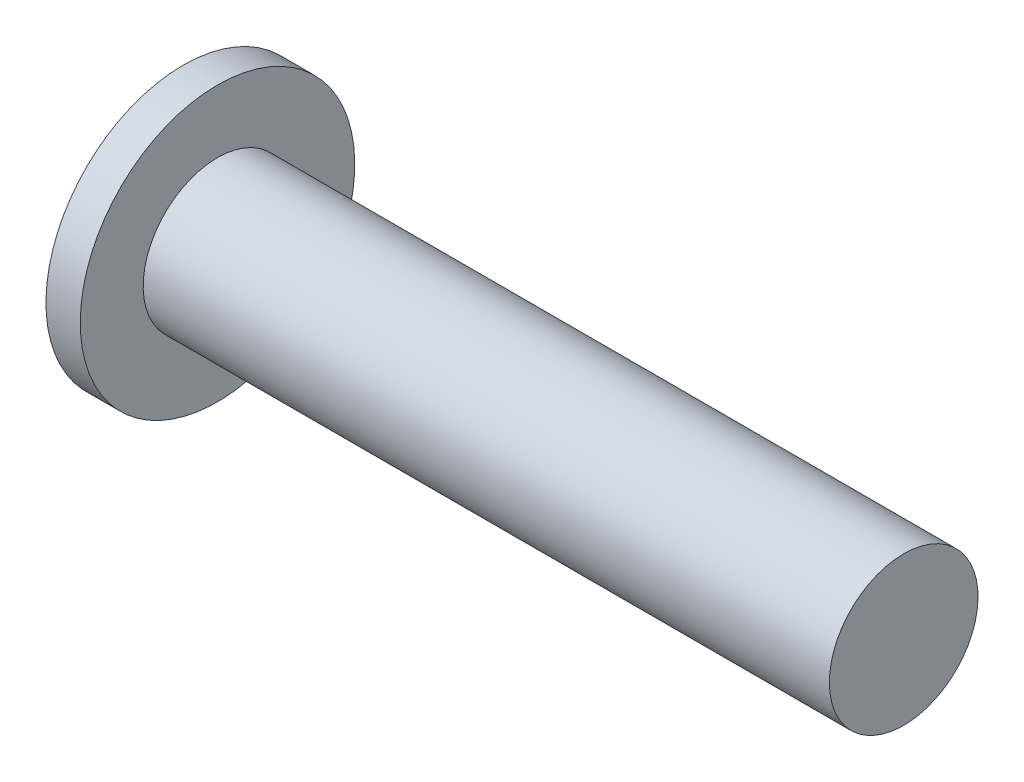
ISO-10303-21;
HEADER;
FILE_DESCRIPTION(('STEP AP214'),'2;1');
FILE_NAME('part.step','',(''),(''),'','','');
FILE_SCHEMA(('AUTOMOTIVE_DESIGN { 1 0 10303 214 1 1 1 1 }'));
ENDSEC;
DATA;
#1=APPLICATION_CONTEXT('core data for automotive mechanical design processes');
#2=APPLICATION_PROTOCOL_DEFINITION('international standard','automotive_design',2000,#1);
#3=PRODUCT_CONTEXT('',#1,'mechanical');
#4=PRODUCT('Part','Part','',(#3));
#5=PRODUCT_RELATED_PRODUCT_CATEGORY('part','',(#4));
#6=PRODUCT_DEFINITION_FORMATION('','',#4);
#7=PRODUCT_DEFINITION_CONTEXT('part definition',#1,'design');
#8=PRODUCT_DEFINITION('design','',#6,#7);
#9=PRODUCT_DEFINITION_SHAPE('','',#8);
#10=(LENGTH_UNIT() NAMED_UNIT(*) SI_UNIT(.MILLI.,.METRE.));
#11=(NAMED_UNIT(*) PLANE_ANGLE_UNIT() SI_UNIT($,.RADIAN.));
#12=(NAMED_UNIT(*) SI_UNIT($,.STERADIAN.) SOLID_ANGLE_UNIT());
#13=UNCERTAINTY_MEASURE_WITH_UNIT(LENGTH_MEASURE(1.E-05),#10,'distance_accuracy_value','');
#14=(GEOMETRIC_REPRESENTATION_CONTEXT(3) GLOBAL_UNCERTAINTY_ASSIGNED_CONTEXT((#13)) GLOBAL_UNIT_ASSIGNED_CONTEXT((#10,
#11,#12)) REPRESENTATION_CONTEXT('',''));
#15=CARTESIAN_POINT('',(0.,0.,0.));
#16=DIRECTION('',(0.,0.,1.));
#17=DIRECTION('',(1.,0.,0.));
#18=AXIS2_PLACEMENT_3D('',#15,#16,#17);
#19=CARTESIAN_POINT('',(0.,0.,0.));
#20=DIRECTION('',(-1.,0.,0.));
#21=DIRECTION('',(0.,-1.,0.));
#22=AXIS2_PLACEMENT_3D('',#19,#20,#21);
#23=PLANE('',#22);
#24=CARTESIAN_POINT('',(0.,0.,0.));
#25=DIRECTION('',(1.,0.,0.));
#26=DIRECTION('',(0.,1.,0.));
#27=AXIS2_PLACEMENT_3D('',#24,#25,#26);
#28=CIRCLE('',#27,6.);
#29=CARTESIAN_POINT('',(0.,6.,0.));
#30=VERTEX_POINT('',#29);
#31=EDGE_CURVE('E10',#30,#30,#28,.T.);
#32=ORIENTED_EDGE('',*,*,#31,.F.);
#33=EDGE_LOOP('',(#32));
#34=FACE_BOUND('',#33,.T.);
#35=ADVANCED_FACE('F31',(#34),#23,.T.);
#36=CARTESIAN_POINT('',(31.5,0.,0.));
#37=DIRECTION('',(1.,0.,0.));
#38=DIRECTION('',(0.,1.,0.));
#39=AXIS2_PLACEMENT_3D('',#36,#37,#38);
#40=CYLINDRICAL_SURFACE('',#39,6.);
#41=ORIENTED_EDGE('',*,*,#31,.T.);
#42=EDGE_LOOP('',(#41));
#43=FACE_BOUND('',#42,.T.);
#44=CARTESIAN_POINT('',(1.5,0.,0.));
#45=DIRECTION('',(1.,0.,0.));
#46=DIRECTION('',(0.,1.,0.));
#47=AXIS2_PLACEMENT_3D('',#44,#45,#46);
#48=CIRCLE('',#47,6.);
#49=CARTESIAN_POINT('',(1.5,6.,0.));
#50=VERTEX_POINT('',#49);
#51=EDGE_CURVE('E37',#50,#50,#48,.T.);
#52=ORIENTED_EDGE('',*,*,#51,.F.);
#53=EDGE_LOOP('',(#52));
#54=FACE_BOUND('',#53,.T.);
#55=ADVANCED_FACE('F63',(#43,#54),#40,.T.);
#56=CARTESIAN_POINT('',(1.5,6.,0.));
#57=DIRECTION('',(1.,0.,0.));
#58=DIRECTION('',(0.,1.,0.));
#59=AXIS2_PLACEMENT_3D('',#56,#57,#58);
#60=PLANE('',#59);
#61=ORIENTED_EDGE('',*,*,#51,.T.);
#62=EDGE_LOOP('',(#61));
#63=FACE_BOUND('',#62,.T.);
#64=CARTESIAN_POINT('',(1.5,0.,0.));
#65=DIRECTION('',(1.,0.,0.));
#66=DIRECTION('',(0.,1.,0.));
#67=AXIS2_PLACEMENT_3D('',#64,#65,#66);
#68=CIRCLE('',#67,3.25);
#69=CARTESIAN_POINT('',(1.5,3.25,0.));
#70=VERTEX_POINT('',#69);
#71=EDGE_CURVE('E41',#70,#70,#68,.T.);
#72=ORIENTED_EDGE('',*,*,#71,.F.);
#73=EDGE_LOOP('',(#72));
#74=FACE_BOUND('',#73,.T.);
#75=ADVANCED_FACE('F55',(#63,#74),#60,.T.);
#76=CARTESIAN_POINT('',(31.5,0.,0.));
#77=DIRECTION('',(1.,0.,0.));
#78=DIRECTION('',(0.,1.,0.));
#79=AXIS2_PLACEMENT_3D('',#76,#77,#78);
#80=CYLINDRICAL_SURFACE('',#79,3.25);
#81=ORIENTED_EDGE('',*,*,#71,.T.);
#82=EDGE_LOOP('',(#81));
#83=FACE_BOUND('',#82,.T.);
#84=CARTESIAN_POINT('',(31.5,0.,0.));
#85=DIRECTION('',(1.,0.,0.));
#86=DIRECTION('',(0.,1.,0.));
#87=AXIS2_PLACEMENT_3D('',#84,#85,#86);
#88=CIRCLE('',#87,3.25);
#89=CARTESIAN_POINT('',(31.5,3.25,0.));
#90=VERTEX_POINT('',#89);
#91=EDGE_CURVE('E45',#90,#90,#88,.T.);
#92=ORIENTED_EDGE('',*,*,#91,.F.);
#93=EDGE_LOOP('',(#92));
#94=FACE_BOUND('',#93,.T.);
#95=ADVANCED_FACE('F53',(#83,#94),#80,.T.);
#96=CARTESIAN_POINT('',(31.5,3.25,0.));
#97=DIRECTION('',(1.,0.,0.));
#98=DIRECTION('',(0.,1.,0.));
#99=AXIS2_PLACEMENT_3D('',#96,#97,#98);
#100=PLANE('',#99);
#101=ORIENTED_EDGE('',*,*,#91,.T.);
#102=EDGE_LOOP('',(#101));
#103=FACE_BOUND('',#102,.T.);
#104=ADVANCED_FACE('F51',(#103),#100,.T.);
#105=CLOSED_SHELL('',(#35,#55,#75,#95,#104));
#106=MANIFOLD_SOLID_BREP('B2',#105);
#107=ADVANCED_BREP_SHAPE_REPRESENTATION('',(#18,#106),#14);
#108=SHAPE_DEFINITION_REPRESENTATION(#9,#107);
ENDSEC;
END-ISO-10303-21;
